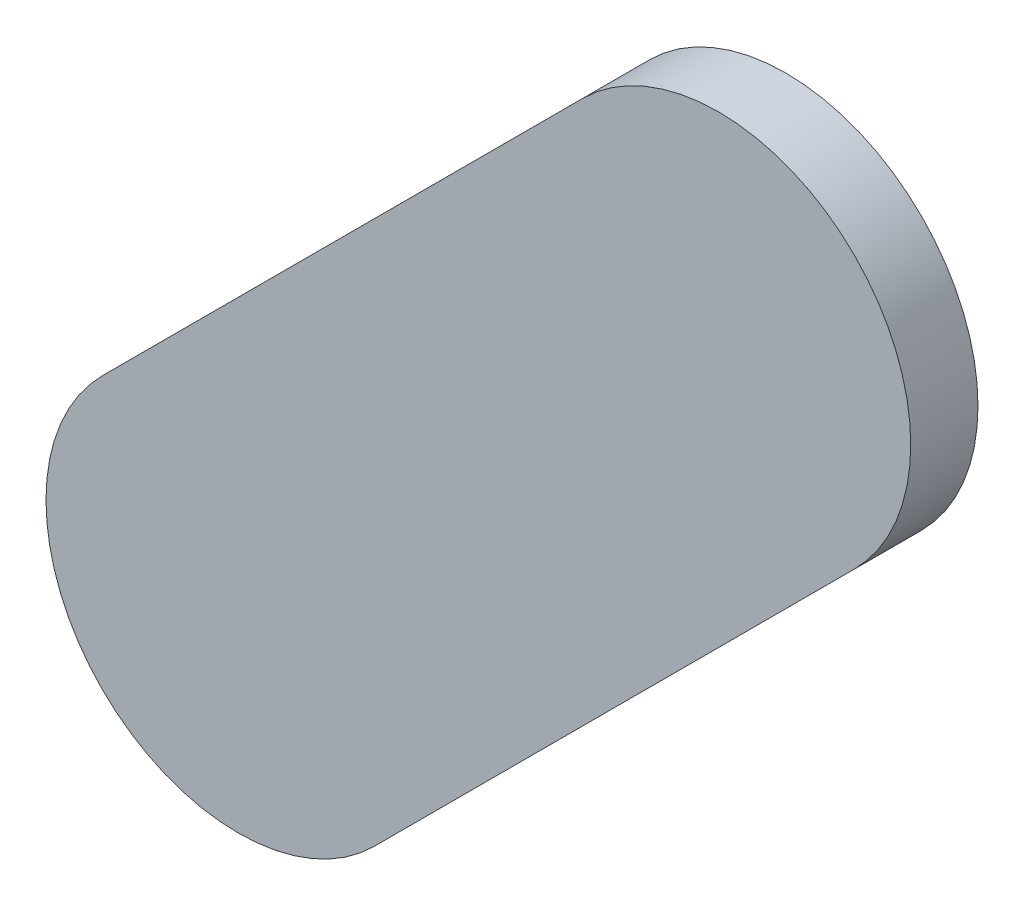
ISO-10303-21;
HEADER;
FILE_DESCRIPTION(('STEP AP214'),'2;1');
FILE_NAME('part.step','',(''),(''),'','','');
FILE_SCHEMA(('AUTOMOTIVE_DESIGN { 1 0 10303 214 1 1 1 1 }'));
ENDSEC;
DATA;
#1=APPLICATION_CONTEXT('core data for automotive mechanical design processes');
#2=APPLICATION_PROTOCOL_DEFINITION('international standard','automotive_design',2000,#1);
#3=PRODUCT_CONTEXT('',#1,'mechanical');
#4=PRODUCT('Part','Part','',(#3));
#5=PRODUCT_RELATED_PRODUCT_CATEGORY('part','',(#4));
#6=PRODUCT_DEFINITION_FORMATION('','',#4);
#7=PRODUCT_DEFINITION_CONTEXT('part definition',#1,'design');
#8=PRODUCT_DEFINITION('design','',#6,#7);
#9=PRODUCT_DEFINITION_SHAPE('','',#8);
#10=(LENGTH_UNIT() NAMED_UNIT(*) SI_UNIT(.MILLI.,.METRE.));
#11=(NAMED_UNIT(*) PLANE_ANGLE_UNIT() SI_UNIT($,.RADIAN.));
#12=(NAMED_UNIT(*) SI_UNIT($,.STERADIAN.) SOLID_ANGLE_UNIT());
#13=UNCERTAINTY_MEASURE_WITH_UNIT(LENGTH_MEASURE(1.E-05),#10,'distance_accuracy_value','');
#14=(GEOMETRIC_REPRESENTATION_CONTEXT(3) GLOBAL_UNCERTAINTY_ASSIGNED_CONTEXT((#13)) GLOBAL_UNIT_ASSIGNED_CONTEXT((#10,
#11,#12)) REPRESENTATION_CONTEXT('',''));
#15=CARTESIAN_POINT('',(0.,0.,0.));
#16=DIRECTION('',(0.,0.,1.));
#17=DIRECTION('',(1.,0.,0.));
#18=AXIS2_PLACEMENT_3D('',#15,#16,#17);
#19=CARTESIAN_POINT('',(149.87071,-116.33371,1.635));
#20=DIRECTION('',(0.,0.,1.));
#21=DIRECTION('',(1.,0.,0.));
#22=AXIS2_PLACEMENT_3D('',#19,#20,#21);
#23=PLANE('',#22);
#24=DIRECTION('',(0.707106781186548,0.707106781186548,0.));
#25=VECTOR('',#24,1.);
#26=CARTESIAN_POINT('',(149.87071,-116.33371,1.635));
#27=LINE('',#26,#25);
#28=CARTESIAN_POINT('',(149.87071,-116.33371,1.635));
#29=VERTEX_POINT('',#28);
#30=CARTESIAN_POINT('',(150.12071,-116.08371,1.635));
#31=VERTEX_POINT('',#30);
#32=EDGE_CURVE('E81',#29,#31,#27,.T.);
#33=ORIENTED_EDGE('',*,*,#32,.T.);
#34=CARTESIAN_POINT('',(150.0499995,-116.0129995,1.635));
#35=DIRECTION('',(0.,0.,1.));
#36=DIRECTION('',(0.707106781186548,-0.707106781186548,0.));
#37=AXIS2_PLACEMENT_3D('',#34,#35,#36);
#38=CIRCLE('',#37,0.09999974810218);
#39=CARTESIAN_POINT('',(149.979289,-115.942289,1.635));
#40=VERTEX_POINT('',#39);
#41=EDGE_CURVE('E97',#31,#40,#38,.T.);
#42=ORIENTED_EDGE('',*,*,#41,.T.);
#43=DIRECTION('',(-0.707106781186548,-0.707106781186548,0.));
#44=VECTOR('',#43,1.);
#45=CARTESIAN_POINT('',(149.979289,-115.942289,1.635));
#46=LINE('',#45,#44);
#47=CARTESIAN_POINT('',(149.729289,-116.192289,1.635));
#48=VERTEX_POINT('',#47);
#49=EDGE_CURVE('E74',#40,#48,#46,.T.);
#50=ORIENTED_EDGE('',*,*,#49,.T.);
#51=CARTESIAN_POINT('',(149.7999995,-116.2629995,1.635));
#52=DIRECTION('',(0.,0.,1.));
#53=DIRECTION('',(-0.707106781187047,0.707106781186048,0.));
#54=AXIS2_PLACEMENT_3D('',#51,#52,#53);
#55=CIRCLE('',#54,0.09999974810219);
#56=EDGE_CURVE('E11',#48,#29,#55,.T.);
#57=ORIENTED_EDGE('',*,*,#56,.T.);
#58=EDGE_LOOP('',(#33,#42,#50,#57));
#59=FACE_BOUND('',#58,.T.);
#60=ADVANCED_FACE('F17',(#59),#23,.T.);
#61=CARTESIAN_POINT('',(149.87071,-116.33371,1.6));
#62=DIRECTION('',(0.,0.,1.));
#63=DIRECTION('',(1.,0.,0.));
#64=AXIS2_PLACEMENT_3D('',#61,#62,#63);
#65=PLANE('',#64);
#66=CARTESIAN_POINT('',(149.7999995,-116.2629995,1.6));
#67=DIRECTION('',(0.,0.,1.));
#68=DIRECTION('',(-0.707106781187047,0.707106781186048,0.));
#69=AXIS2_PLACEMENT_3D('',#66,#67,#68);
#70=CIRCLE('',#69,0.09999974810219);
#71=CARTESIAN_POINT('',(149.729289,-116.192289,1.6));
#72=VERTEX_POINT('',#71);
#73=CARTESIAN_POINT('',(149.87071,-116.33371,1.6));
#74=VERTEX_POINT('',#73);
#75=EDGE_CURVE('E25',#72,#74,#70,.T.);
#76=ORIENTED_EDGE('',*,*,#75,.F.);
#77=DIRECTION('',(-0.707106781186548,-0.707106781186548,0.));
#78=VECTOR('',#77,1.);
#79=CARTESIAN_POINT('',(149.979289,-115.942289,1.6));
#80=LINE('',#79,#78);
#81=CARTESIAN_POINT('',(149.979289,-115.942289,1.6));
#82=VERTEX_POINT('',#81);
#83=EDGE_CURVE('E100',#82,#72,#80,.T.);
#84=ORIENTED_EDGE('',*,*,#83,.F.);
#85=CARTESIAN_POINT('',(150.0499995,-116.0129995,1.6));
#86=DIRECTION('',(0.,0.,1.));
#87=DIRECTION('',(0.707106781186548,-0.707106781186548,0.));
#88=AXIS2_PLACEMENT_3D('',#85,#86,#87);
#89=CIRCLE('',#88,0.09999974810218);
#90=CARTESIAN_POINT('',(150.12071,-116.08371,1.6));
#91=VERTEX_POINT('',#90);
#92=EDGE_CURVE('E83',#91,#82,#89,.T.);
#93=ORIENTED_EDGE('',*,*,#92,.F.);
#94=DIRECTION('',(0.707106781186548,0.707106781186548,0.));
#95=VECTOR('',#94,1.);
#96=CARTESIAN_POINT('',(149.87071,-116.33371,1.6));
#97=LINE('',#96,#95);
#98=EDGE_CURVE('E79',#74,#91,#97,.T.);
#99=ORIENTED_EDGE('',*,*,#98,.F.);
#100=EDGE_LOOP('',(#76,#84,#93,#99));
#101=FACE_BOUND('',#100,.T.);
#102=ADVANCED_FACE('F85',(#101),#65,.F.);
#103=CARTESIAN_POINT('',(149.7999995,-116.2629995,1.6));
#104=DIRECTION('',(0.,0.,-1.));
#105=DIRECTION('',(-0.707106781187048,0.707106781186048,0.));
#106=AXIS2_PLACEMENT_3D('',#103,#104,#105);
#107=CYLINDRICAL_SURFACE('',#106,0.09999974810219);
#108=ORIENTED_EDGE('',*,*,#75,.T.);
#109=DIRECTION('',(0.,0.,1.));
#110=VECTOR('',#109,1.);
#111=CARTESIAN_POINT('',(149.87071,-116.33371,1.6));
#112=LINE('',#111,#110);
#113=EDGE_CURVE('E68',#74,#29,#112,.T.);
#114=ORIENTED_EDGE('',*,*,#113,.T.);
#115=ORIENTED_EDGE('',*,*,#56,.F.);
#116=DIRECTION('',(0.,0.,1.));
#117=VECTOR('',#116,1.);
#118=CARTESIAN_POINT('',(149.729289,-116.192289,1.6));
#119=LINE('',#118,#117);
#120=EDGE_CURVE('E71',#72,#48,#119,.T.);
#121=ORIENTED_EDGE('',*,*,#120,.F.);
#122=EDGE_LOOP('',(#108,#114,#115,#121));
#123=FACE_BOUND('',#122,.T.);
#124=ADVANCED_FACE('F67',(#123),#107,.T.);
#125=CARTESIAN_POINT('',(149.979289,-115.942289,1.6));
#126=DIRECTION('',(0.707106781186548,-0.707106781186548,0.));
#127=DIRECTION('',(0.,0.,-1.));
#128=AXIS2_PLACEMENT_3D('',#125,#126,#127);
#129=PLANE('',#128);
#130=ORIENTED_EDGE('',*,*,#83,.T.);
#131=ORIENTED_EDGE('',*,*,#120,.T.);
#132=ORIENTED_EDGE('',*,*,#49,.F.);
#133=DIRECTION('',(0.,0.,1.));
#134=VECTOR('',#133,1.);
#135=CARTESIAN_POINT('',(149.979289,-115.942289,1.6));
#136=LINE('',#135,#134);
#137=EDGE_CURVE('E101',#82,#40,#136,.T.);
#138=ORIENTED_EDGE('',*,*,#137,.F.);
#139=EDGE_LOOP('',(#130,#131,#132,#138));
#140=FACE_BOUND('',#139,.T.);
#141=ADVANCED_FACE('F120',(#140),#129,.F.);
#142=CARTESIAN_POINT('',(150.0499995,-116.0129995,1.6));
#143=DIRECTION('',(0.,0.,-1.));
#144=DIRECTION('',(0.707106781186548,-0.707106781186548,0.));
#145=AXIS2_PLACEMENT_3D('',#142,#143,#144);
#146=CYLINDRICAL_SURFACE('',#145,0.09999974810218);
#147=ORIENTED_EDGE('',*,*,#92,.T.);
#148=ORIENTED_EDGE('',*,*,#137,.T.);
#149=ORIENTED_EDGE('',*,*,#41,.F.);
#150=DIRECTION('',(0.,0.,1.));
#151=VECTOR('',#150,1.);
#152=CARTESIAN_POINT('',(150.12071,-116.08371,1.6));
#153=LINE('',#152,#151);
#154=EDGE_CURVE('E89',#91,#31,#153,.T.);
#155=ORIENTED_EDGE('',*,*,#154,.F.);
#156=EDGE_LOOP('',(#147,#148,#149,#155));
#157=FACE_BOUND('',#156,.T.);
#158=ADVANCED_FACE('F122',(#157),#146,.T.);
#159=CARTESIAN_POINT('',(149.87071,-116.33371,1.6));
#160=DIRECTION('',(-0.707106781186548,0.707106781186548,0.));
#161=DIRECTION('',(0.,0.,1.));
#162=AXIS2_PLACEMENT_3D('',#159,#160,#161);
#163=PLANE('',#162);
#164=ORIENTED_EDGE('',*,*,#98,.T.);
#165=ORIENTED_EDGE('',*,*,#154,.T.);
#166=ORIENTED_EDGE('',*,*,#32,.F.);
#167=ORIENTED_EDGE('',*,*,#113,.F.);
#168=EDGE_LOOP('',(#164,#165,#166,#167));
#169=FACE_BOUND('',#168,.T.);
#170=ADVANCED_FACE('F77',(#169),#163,.F.);
#171=CLOSED_SHELL('',(#60,#102,#124,#141,#158,#170));
#172=MANIFOLD_SOLID_BREP('B1',#171);
#173=ADVANCED_BREP_SHAPE_REPRESENTATION('',(#18,#172),#14);
#174=SHAPE_DEFINITION_REPRESENTATION(#9,#173);
ENDSEC;
END-ISO-10303-21;
